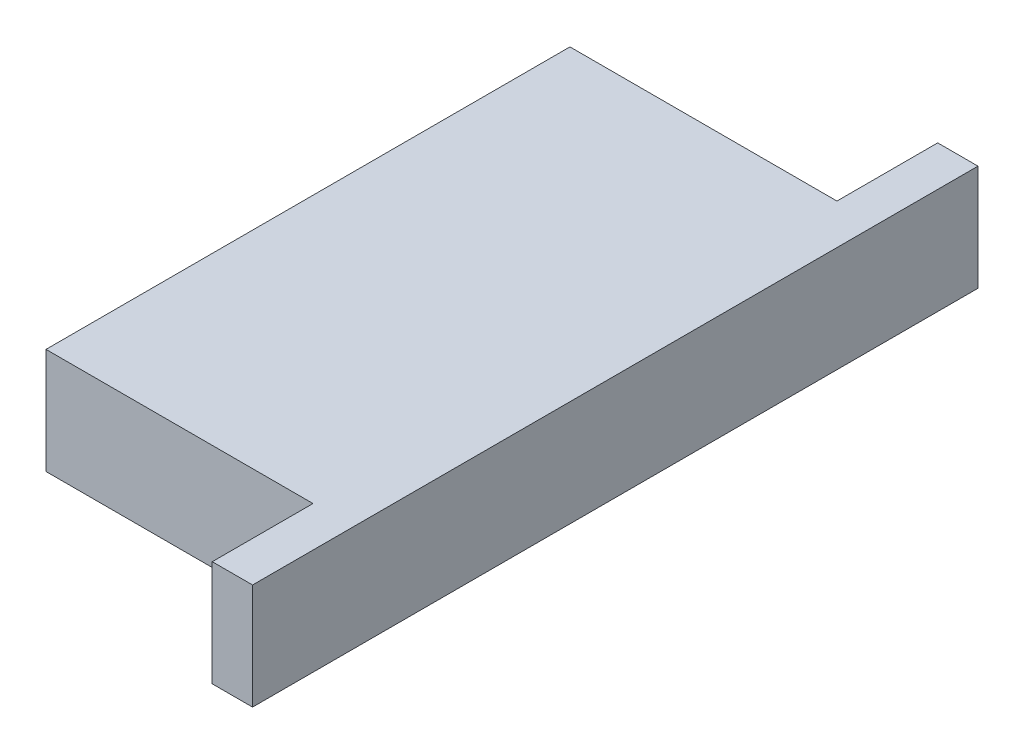
ISO-10303-21;
HEADER;
FILE_DESCRIPTION(('STEP AP214'),'2;1');
FILE_NAME('part.step','',(''),(''),'','','');
FILE_SCHEMA(('AUTOMOTIVE_DESIGN { 1 0 10303 214 1 1 1 1 }'));
ENDSEC;
DATA;
#1=APPLICATION_CONTEXT('core data for automotive mechanical design processes');
#2=APPLICATION_PROTOCOL_DEFINITION('international standard','automotive_design',2000,#1);
#3=PRODUCT_CONTEXT('',#1,'mechanical');
#4=PRODUCT('Part','Part','',(#3));
#5=PRODUCT_RELATED_PRODUCT_CATEGORY('part','',(#4));
#6=PRODUCT_DEFINITION_FORMATION('','',#4);
#7=PRODUCT_DEFINITION_CONTEXT('part definition',#1,'design');
#8=PRODUCT_DEFINITION('design','',#6,#7);
#9=PRODUCT_DEFINITION_SHAPE('','',#8);
#10=(LENGTH_UNIT() NAMED_UNIT(*) SI_UNIT(.MILLI.,.METRE.));
#11=(NAMED_UNIT(*) PLANE_ANGLE_UNIT() SI_UNIT($,.RADIAN.));
#12=(NAMED_UNIT(*) SI_UNIT($,.STERADIAN.) SOLID_ANGLE_UNIT());
#13=UNCERTAINTY_MEASURE_WITH_UNIT(LENGTH_MEASURE(1.E-05),#10,'distance_accuracy_value','');
#14=(GEOMETRIC_REPRESENTATION_CONTEXT(3) GLOBAL_UNCERTAINTY_ASSIGNED_CONTEXT((#13)) GLOBAL_UNIT_ASSIGNED_CONTEXT((#10,
#11,#12)) REPRESENTATION_CONTEXT('',''));
#15=CARTESIAN_POINT('',(0.,0.,0.));
#16=DIRECTION('',(0.,0.,1.));
#17=DIRECTION('',(1.,0.,0.));
#18=AXIS2_PLACEMENT_3D('',#15,#16,#17);
#19=CARTESIAN_POINT('',(11.25,10.5,36.));
#20=DIRECTION('',(-1.,0.,0.));
#21=DIRECTION('',(0.,0.,1.));
#22=AXIS2_PLACEMENT_3D('',#19,#20,#21);
#23=PLANE('',#22);
#24=DIRECTION('',(0.,0.,-1.));
#25=VECTOR('',#24,1.);
#26=CARTESIAN_POINT('',(11.25,0.,36.));
#27=LINE('',#26,#25);
#28=CARTESIAN_POINT('',(11.25,0.,36.));
#29=VERTEX_POINT('',#28);
#30=CARTESIAN_POINT('',(11.25,0.,26.));
#31=VERTEX_POINT('',#30);
#32=EDGE_CURVE('E133',#29,#31,#27,.T.);
#33=ORIENTED_EDGE('',*,*,#32,.F.);
#34=DIRECTION('',(0.,-1.,0.));
#35=VECTOR('',#34,1.);
#36=CARTESIAN_POINT('',(11.25,10.5,36.));
#37=LINE('',#36,#35);
#38=CARTESIAN_POINT('',(11.25,10.5,36.));
#39=VERTEX_POINT('',#38);
#40=EDGE_CURVE('E11',#39,#29,#37,.T.);
#41=ORIENTED_EDGE('',*,*,#40,.F.);
#42=DIRECTION('',(0.,0.,-1.));
#43=VECTOR('',#42,1.);
#44=CARTESIAN_POINT('',(11.25,10.5,36.));
#45=LINE('',#44,#43);
#46=CARTESIAN_POINT('',(11.25,10.5,26.));
#47=VERTEX_POINT('',#46);
#48=EDGE_CURVE('E151',#39,#47,#45,.T.);
#49=ORIENTED_EDGE('',*,*,#48,.T.);
#50=DIRECTION('',(0.,-1.,0.));
#51=VECTOR('',#50,1.);
#52=CARTESIAN_POINT('',(11.25,10.5,26.));
#53=LINE('',#52,#51);
#54=EDGE_CURVE('E42',#47,#31,#53,.T.);
#55=ORIENTED_EDGE('',*,*,#54,.T.);
#56=EDGE_LOOP('',(#33,#41,#49,#55));
#57=FACE_BOUND('',#56,.T.);
#58=ADVANCED_FACE('F39',(#57),#23,.T.);
#59=CARTESIAN_POINT('',(15.25,10.5,36.));
#60=DIRECTION('',(0.,0.,1.));
#61=DIRECTION('',(1.,0.,0.));
#62=AXIS2_PLACEMENT_3D('',#59,#60,#61);
#63=PLANE('',#62);
#64=DIRECTION('',(-1.,0.,0.));
#65=VECTOR('',#64,1.);
#66=CARTESIAN_POINT('',(15.25,0.,36.));
#67=LINE('',#66,#65);
#68=CARTESIAN_POINT('',(15.25,0.,36.));
#69=VERTEX_POINT('',#68);
#70=EDGE_CURVE('E149',#69,#29,#67,.T.);
#71=ORIENTED_EDGE('',*,*,#70,.F.);
#72=DIRECTION('',(0.,-1.,0.));
#73=VECTOR('',#72,1.);
#74=CARTESIAN_POINT('',(15.25,10.5,36.));
#75=LINE('',#74,#73);
#76=CARTESIAN_POINT('',(15.25,10.5,36.));
#77=VERTEX_POINT('',#76);
#78=EDGE_CURVE('E48',#77,#69,#75,.T.);
#79=ORIENTED_EDGE('',*,*,#78,.F.);
#80=DIRECTION('',(-1.,0.,0.));
#81=VECTOR('',#80,1.);
#82=CARTESIAN_POINT('',(15.25,10.5,36.));
#83=LINE('',#82,#81);
#84=EDGE_CURVE('E128',#77,#39,#83,.T.);
#85=ORIENTED_EDGE('',*,*,#84,.T.);
#86=ORIENTED_EDGE('',*,*,#40,.T.);
#87=EDGE_LOOP('',(#71,#79,#85,#86));
#88=FACE_BOUND('',#87,.T.);
#89=ADVANCED_FACE('F166',(#88),#63,.T.);
#90=CARTESIAN_POINT('',(15.25,10.5,-36.));
#91=DIRECTION('',(1.,0.,0.));
#92=DIRECTION('',(0.,0.,-1.));
#93=AXIS2_PLACEMENT_3D('',#90,#91,#92);
#94=PLANE('',#93);
#95=DIRECTION('',(0.,0.,1.));
#96=VECTOR('',#95,1.);
#97=CARTESIAN_POINT('',(15.25,0.,-36.));
#98=LINE('',#97,#96);
#99=CARTESIAN_POINT('',(15.25,0.,-36.));
#100=VERTEX_POINT('',#99);
#101=EDGE_CURVE('E114',#100,#69,#98,.T.);
#102=ORIENTED_EDGE('',*,*,#101,.F.);
#103=DIRECTION('',(0.,-1.,0.));
#104=VECTOR('',#103,1.);
#105=CARTESIAN_POINT('',(15.25,10.5,-36.));
#106=LINE('',#105,#104);
#107=CARTESIAN_POINT('',(15.25,10.5,-36.));
#108=VERTEX_POINT('',#107);
#109=EDGE_CURVE('E108',#108,#100,#106,.T.);
#110=ORIENTED_EDGE('',*,*,#109,.F.);
#111=DIRECTION('',(0.,0.,1.));
#112=VECTOR('',#111,1.);
#113=CARTESIAN_POINT('',(15.25,10.5,-36.));
#114=LINE('',#113,#112);
#115=EDGE_CURVE('E112',#108,#77,#114,.T.);
#116=ORIENTED_EDGE('',*,*,#115,.T.);
#117=ORIENTED_EDGE('',*,*,#78,.T.);
#118=EDGE_LOOP('',(#102,#110,#116,#117));
#119=FACE_BOUND('',#118,.T.);
#120=ADVANCED_FACE('F110',(#119),#94,.T.);
#121=CARTESIAN_POINT('',(15.25,10.5,-36.));
#122=DIRECTION('',(0.,0.,1.));
#123=DIRECTION('',(1.,0.,0.));
#124=AXIS2_PLACEMENT_3D('',#121,#122,#123);
#125=PLANE('',#124);
#126=DIRECTION('',(-1.,0.,0.));
#127=VECTOR('',#126,1.);
#128=CARTESIAN_POINT('',(15.25,0.,-36.));
#129=LINE('',#128,#127);
#130=CARTESIAN_POINT('',(11.25,0.,-36.));
#131=VERTEX_POINT('',#130);
#132=EDGE_CURVE('E146',#100,#131,#129,.T.);
#133=ORIENTED_EDGE('',*,*,#132,.T.);
#134=DIRECTION('',(0.,-1.,0.));
#135=VECTOR('',#134,1.);
#136=CARTESIAN_POINT('',(11.25,10.5,-36.));
#137=LINE('',#136,#135);
#138=CARTESIAN_POINT('',(11.25,10.5,-36.));
#139=VERTEX_POINT('',#138);
#140=EDGE_CURVE('E117',#139,#131,#137,.T.);
#141=ORIENTED_EDGE('',*,*,#140,.F.);
#142=DIRECTION('',(-1.,0.,0.));
#143=VECTOR('',#142,1.);
#144=CARTESIAN_POINT('',(15.25,10.5,-36.));
#145=LINE('',#144,#143);
#146=EDGE_CURVE('E120',#108,#139,#145,.T.);
#147=ORIENTED_EDGE('',*,*,#146,.F.);
#148=ORIENTED_EDGE('',*,*,#109,.T.);
#149=EDGE_LOOP('',(#133,#141,#147,#148));
#150=FACE_BOUND('',#149,.T.);
#151=ADVANCED_FACE('F121',(#150),#125,.F.);
#152=CARTESIAN_POINT('',(11.25,10.5,-36.));
#153=DIRECTION('',(1.,0.,0.));
#154=DIRECTION('',(0.,0.,-1.));
#155=AXIS2_PLACEMENT_3D('',#152,#153,#154);
#156=PLANE('',#155);
#157=DIRECTION('',(0.,0.,1.));
#158=VECTOR('',#157,1.);
#159=CARTESIAN_POINT('',(11.25,0.,-36.));
#160=LINE('',#159,#158);
#161=CARTESIAN_POINT('',(11.25,0.,-26.));
#162=VERTEX_POINT('',#161);
#163=EDGE_CURVE('E144',#131,#162,#160,.T.);
#164=ORIENTED_EDGE('',*,*,#163,.T.);
#165=DIRECTION('',(0.,-1.,0.));
#166=VECTOR('',#165,1.);
#167=CARTESIAN_POINT('',(11.25,10.5,-26.));
#168=LINE('',#167,#166);
#169=CARTESIAN_POINT('',(11.25,10.5,-26.));
#170=VERTEX_POINT('',#169);
#171=EDGE_CURVE('E155',#170,#162,#168,.T.);
#172=ORIENTED_EDGE('',*,*,#171,.F.);
#173=DIRECTION('',(0.,0.,1.));
#174=VECTOR('',#173,1.);
#175=CARTESIAN_POINT('',(11.25,10.5,-36.));
#176=LINE('',#175,#174);
#177=EDGE_CURVE('E125',#139,#170,#176,.T.);
#178=ORIENTED_EDGE('',*,*,#177,.F.);
#179=ORIENTED_EDGE('',*,*,#140,.T.);
#180=EDGE_LOOP('',(#164,#172,#178,#179));
#181=FACE_BOUND('',#180,.T.);
#182=ADVANCED_FACE('F179',(#181),#156,.F.);
#183=CARTESIAN_POINT('',(11.25,10.5,-26.));
#184=DIRECTION('',(0.,0.,1.));
#185=DIRECTION('',(1.,0.,0.));
#186=AXIS2_PLACEMENT_3D('',#183,#184,#185);
#187=PLANE('',#186);
#188=DIRECTION('',(-1.,0.,0.));
#189=VECTOR('',#188,1.);
#190=CARTESIAN_POINT('',(11.25,0.,-26.));
#191=LINE('',#190,#189);
#192=CARTESIAN_POINT('',(-15.25,0.,-26.));
#193=VERTEX_POINT('',#192);
#194=EDGE_CURVE('E142',#162,#193,#191,.T.);
#195=ORIENTED_EDGE('',*,*,#194,.T.);
#196=DIRECTION('',(0.,-1.,0.));
#197=VECTOR('',#196,1.);
#198=CARTESIAN_POINT('',(-15.25,10.5,-26.));
#199=LINE('',#198,#197);
#200=CARTESIAN_POINT('',(-15.25,10.5,-26.));
#201=VERTEX_POINT('',#200);
#202=EDGE_CURVE('E158',#201,#193,#199,.T.);
#203=ORIENTED_EDGE('',*,*,#202,.F.);
#204=DIRECTION('',(-1.,0.,0.));
#205=VECTOR('',#204,1.);
#206=CARTESIAN_POINT('',(11.25,10.5,-26.));
#207=LINE('',#206,#205);
#208=EDGE_CURVE('E257',#170,#201,#207,.T.);
#209=ORIENTED_EDGE('',*,*,#208,.F.);
#210=ORIENTED_EDGE('',*,*,#171,.T.);
#211=EDGE_LOOP('',(#195,#203,#209,#210));
#212=FACE_BOUND('',#211,.T.);
#213=ADVANCED_FACE('F182',(#212),#187,.F.);
#214=CARTESIAN_POINT('',(-15.25,10.5,-26.));
#215=DIRECTION('',(1.,0.,0.));
#216=DIRECTION('',(0.,0.,-1.));
#217=AXIS2_PLACEMENT_3D('',#214,#215,#216);
#218=PLANE('',#217);
#219=DIRECTION('',(0.,0.,1.));
#220=VECTOR('',#219,1.);
#221=CARTESIAN_POINT('',(-15.25,0.,-26.));
#222=LINE('',#221,#220);
#223=CARTESIAN_POINT('',(-15.25,0.,26.));
#224=VERTEX_POINT('',#223);
#225=EDGE_CURVE('E139',#193,#224,#222,.T.);
#226=ORIENTED_EDGE('',*,*,#225,.T.);
#227=DIRECTION('',(0.,-1.,0.));
#228=VECTOR('',#227,1.);
#229=CARTESIAN_POINT('',(-15.25,10.5,26.));
#230=LINE('',#229,#228);
#231=CARTESIAN_POINT('',(-15.25,10.5,26.));
#232=VERTEX_POINT('',#231);
#233=EDGE_CURVE('E160',#232,#224,#230,.T.);
#234=ORIENTED_EDGE('',*,*,#233,.F.);
#235=DIRECTION('',(0.,0.,1.));
#236=VECTOR('',#235,1.);
#237=CARTESIAN_POINT('',(-15.25,10.5,-26.));
#238=LINE('',#237,#236);
#239=EDGE_CURVE('E258',#201,#232,#238,.T.);
#240=ORIENTED_EDGE('',*,*,#239,.F.);
#241=ORIENTED_EDGE('',*,*,#202,.T.);
#242=EDGE_LOOP('',(#226,#234,#240,#241));
#243=FACE_BOUND('',#242,.T.);
#244=ADVANCED_FACE('F186',(#243),#218,.F.);
#245=CARTESIAN_POINT('',(11.25,10.5,26.));
#246=DIRECTION('',(0.,0.,1.));
#247=DIRECTION('',(1.,0.,0.));
#248=AXIS2_PLACEMENT_3D('',#245,#246,#247);
#249=PLANE('',#248);
#250=DIRECTION('',(-1.,0.,0.));
#251=VECTOR('',#250,1.);
#252=CARTESIAN_POINT('',(11.25,0.,26.));
#253=LINE('',#252,#251);
#254=EDGE_CURVE('E136',#31,#224,#253,.T.);
#255=ORIENTED_EDGE('',*,*,#254,.F.);
#256=ORIENTED_EDGE('',*,*,#54,.F.);
#257=DIRECTION('',(-1.,0.,0.));
#258=VECTOR('',#257,1.);
#259=CARTESIAN_POINT('',(11.25,10.5,26.));
#260=LINE('',#259,#258);
#261=EDGE_CURVE('E262',#47,#232,#260,.T.);
#262=ORIENTED_EDGE('',*,*,#261,.T.);
#263=ORIENTED_EDGE('',*,*,#233,.T.);
#264=EDGE_LOOP('',(#255,#256,#262,#263));
#265=FACE_BOUND('',#264,.T.);
#266=ADVANCED_FACE('F162',(#265),#249,.T.);
#267=CARTESIAN_POINT('',(0.,10.5,0.));
#268=DIRECTION('',(0.,1.,0.));
#269=DIRECTION('',(0.,0.,1.));
#270=AXIS2_PLACEMENT_3D('',#267,#268,#269);
#271=PLANE('',#270);
#272=ORIENTED_EDGE('',*,*,#48,.F.);
#273=ORIENTED_EDGE('',*,*,#84,.F.);
#274=ORIENTED_EDGE('',*,*,#115,.F.);
#275=ORIENTED_EDGE('',*,*,#146,.T.);
#276=ORIENTED_EDGE('',*,*,#177,.T.);
#277=ORIENTED_EDGE('',*,*,#208,.T.);
#278=ORIENTED_EDGE('',*,*,#239,.T.);
#279=ORIENTED_EDGE('',*,*,#261,.F.);
#280=EDGE_LOOP('',(#272,#273,#274,#275,#276,#277,#278,#279));
#281=FACE_BOUND('',#280,.T.);
#282=ADVANCED_FACE('F127',(#281),#271,.T.);
#283=CARTESIAN_POINT('',(0.,0.,0.));
#284=DIRECTION('',(0.,1.,0.));
#285=DIRECTION('',(0.,0.,1.));
#286=AXIS2_PLACEMENT_3D('',#283,#284,#285);
#287=PLANE('',#286);
#288=ORIENTED_EDGE('',*,*,#32,.T.);
#289=ORIENTED_EDGE('',*,*,#254,.T.);
#290=ORIENTED_EDGE('',*,*,#225,.F.);
#291=ORIENTED_EDGE('',*,*,#194,.F.);
#292=ORIENTED_EDGE('',*,*,#163,.F.);
#293=ORIENTED_EDGE('',*,*,#132,.F.);
#294=ORIENTED_EDGE('',*,*,#101,.T.);
#295=ORIENTED_EDGE('',*,*,#70,.T.);
#296=EDGE_LOOP('',(#288,#289,#290,#291,#292,#293,#294,#295));
#297=FACE_BOUND('',#296,.T.);
#298=ADVANCED_FACE('F165',(#297),#287,.F.);
#299=CLOSED_SHELL('',(#58,#89,#120,#151,#182,#213,#244,#266,#282,#298));
#300=MANIFOLD_SOLID_BREP('B2',#299);
#301=ADVANCED_BREP_SHAPE_REPRESENTATION('',(#18,#300),#14);
#302=SHAPE_DEFINITION_REPRESENTATION(#9,#301);
ENDSEC;
END-ISO-10303-21;
